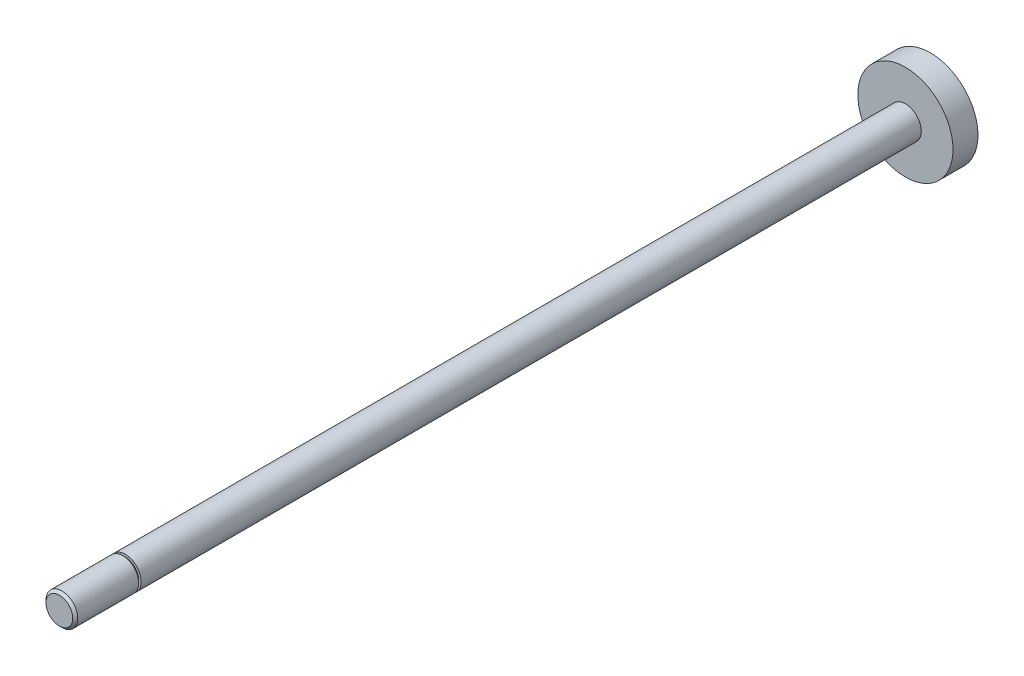
ISO-10303-21;
HEADER;
FILE_DESCRIPTION(('STEP AP214'),'2;1');
FILE_NAME('part.step','',(''),(''),'','','');
FILE_SCHEMA(('AUTOMOTIVE_DESIGN { 1 0 10303 214 1 1 1 1 }'));
ENDSEC;
DATA;
#1=APPLICATION_CONTEXT('core data for automotive mechanical design processes');
#2=APPLICATION_PROTOCOL_DEFINITION('international standard','automotive_design',2000,#1);
#3=PRODUCT_CONTEXT('',#1,'mechanical');
#4=PRODUCT('Part','Part','',(#3));
#5=PRODUCT_RELATED_PRODUCT_CATEGORY('part','',(#4));
#6=PRODUCT_DEFINITION_FORMATION('','',#4);
#7=PRODUCT_DEFINITION_CONTEXT('part definition',#1,'design');
#8=PRODUCT_DEFINITION('design','',#6,#7);
#9=PRODUCT_DEFINITION_SHAPE('','',#8);
#10=(LENGTH_UNIT() NAMED_UNIT(*) SI_UNIT(.MILLI.,.METRE.));
#11=(NAMED_UNIT(*) PLANE_ANGLE_UNIT() SI_UNIT($,.RADIAN.));
#12=(NAMED_UNIT(*) SI_UNIT($,.STERADIAN.) SOLID_ANGLE_UNIT());
#13=UNCERTAINTY_MEASURE_WITH_UNIT(LENGTH_MEASURE(1.E-05),#10,'distance_accuracy_value','');
#14=(GEOMETRIC_REPRESENTATION_CONTEXT(3) GLOBAL_UNCERTAINTY_ASSIGNED_CONTEXT((#13)) GLOBAL_UNIT_ASSIGNED_CONTEXT((#10,
#11,#12)) REPRESENTATION_CONTEXT('',''));
#15=CARTESIAN_POINT('',(0.,0.,0.));
#16=DIRECTION('',(0.,0.,1.));
#17=DIRECTION('',(1.,0.,0.));
#18=AXIS2_PLACEMENT_3D('',#15,#16,#17);
#19=CARTESIAN_POINT('',(0.,0.,2.5));
#20=DIRECTION('',(0.,0.,1.));
#21=DIRECTION('',(1.,0.,0.));
#22=AXIS2_PLACEMENT_3D('',#19,#20,#21);
#23=PLANE('',#22);
#24=CARTESIAN_POINT('',(0.,0.,2.5));
#25=DIRECTION('',(0.,0.,1.));
#26=DIRECTION('',(1.,0.,0.));
#27=AXIS2_PLACEMENT_3D('',#24,#25,#26);
#28=CIRCLE('',#27,9.525);
#29=CARTESIAN_POINT('',(9.525,0.,2.5));
#30=VERTEX_POINT('',#29);
#31=EDGE_CURVE('E45',#30,#30,#28,.T.);
#32=ORIENTED_EDGE('',*,*,#31,.T.);
#33=EDGE_LOOP('',(#32));
#34=FACE_BOUND('',#33,.T.);
#35=CARTESIAN_POINT('',(0.,0.,2.5));
#36=DIRECTION('',(0.,0.,1.));
#37=DIRECTION('',(1.,0.,0.));
#38=AXIS2_PLACEMENT_3D('',#35,#36,#37);
#39=CIRCLE('',#38,3.175);
#40=CARTESIAN_POINT('',(3.175,0.,2.5));
#41=VERTEX_POINT('',#40);
#42=EDGE_CURVE('E10',#41,#41,#39,.T.);
#43=ORIENTED_EDGE('',*,*,#42,.F.);
#44=EDGE_LOOP('',(#43));
#45=FACE_BOUND('',#44,.T.);
#46=ADVANCED_FACE('F37',(#34,#45),#23,.T.);
#47=CARTESIAN_POINT('',(0.,0.,2.5));
#48=DIRECTION('',(0.,0.,-1.));
#49=DIRECTION('',(-1.,0.,0.));
#50=AXIS2_PLACEMENT_3D('',#47,#48,#49);
#51=CYLINDRICAL_SURFACE('',#50,9.525);
#52=ORIENTED_EDGE('',*,*,#31,.F.);
#53=EDGE_LOOP('',(#52));
#54=FACE_BOUND('',#53,.T.);
#55=CARTESIAN_POINT('',(0.,0.,-2.5));
#56=DIRECTION('',(0.,0.,1.));
#57=DIRECTION('',(1.,0.,0.));
#58=AXIS2_PLACEMENT_3D('',#55,#56,#57);
#59=CIRCLE('',#58,9.525);
#60=CARTESIAN_POINT('',(9.525,0.,-2.5));
#61=VERTEX_POINT('',#60);
#62=EDGE_CURVE('E49',#61,#61,#59,.T.);
#63=ORIENTED_EDGE('',*,*,#62,.T.);
#64=EDGE_LOOP('',(#63));
#65=FACE_BOUND('',#64,.T.);
#66=ADVANCED_FACE('F105',(#54,#65),#51,.T.);
#67=CARTESIAN_POINT('',(0.,0.,-2.5));
#68=DIRECTION('',(0.,0.,1.));
#69=DIRECTION('',(1.,0.,0.));
#70=AXIS2_PLACEMENT_3D('',#67,#68,#69);
#71=PLANE('',#70);
#72=ORIENTED_EDGE('',*,*,#62,.F.);
#73=EDGE_LOOP('',(#72));
#74=FACE_BOUND('',#73,.T.);
#75=ADVANCED_FACE('F102',(#74),#71,.F.);
#76=CARTESIAN_POINT('',(0.,0.,180.811256121069));
#77=DIRECTION('',(0.,0.,-1.));
#78=DIRECTION('',(-1.,0.,0.));
#79=AXIS2_PLACEMENT_3D('',#76,#77,#78);
#80=CYLINDRICAL_SURFACE('',#79,3.175);
#81=CARTESIAN_POINT('',(0.,0.,158.631));
#82=DIRECTION('',(0.,0.,-1.));
#83=DIRECTION('',(-1.,0.,0.));
#84=AXIS2_PLACEMENT_3D('',#81,#82,#83);
#85=CIRCLE('',#84,3.175);
#86=CARTESIAN_POINT('',(-3.175,0.,158.631));
#87=VERTEX_POINT('',#86);
#88=EDGE_CURVE('E41',#87,#87,#85,.T.);
#89=ORIENTED_EDGE('',*,*,#88,.T.);
#90=EDGE_LOOP('',(#89));
#91=FACE_BOUND('',#90,.T.);
#92=ORIENTED_EDGE('',*,*,#42,.T.);
#93=EDGE_LOOP('',(#92));
#94=FACE_BOUND('',#93,.T.);
#95=ADVANCED_FACE('F39',(#91,#94),#80,.T.);
#96=CARTESIAN_POINT('',(0.,2.67499999999997,158.631));
#97=DIRECTION('',(0.,0.,-1.));
#98=DIRECTION('',(-1.,0.,0.));
#99=AXIS2_PLACEMENT_3D('',#96,#97,#98);
#100=PLANE('',#99);
#101=CARTESIAN_POINT('',(0.,0.,158.631));
#102=DIRECTION('',(0.,0.,-1.));
#103=DIRECTION('',(-1.,0.,0.));
#104=AXIS2_PLACEMENT_3D('',#101,#102,#103);
#105=CIRCLE('',#104,2.67499999999997);
#106=CARTESIAN_POINT('',(-2.67499999999997,0.,158.631));
#107=VERTEX_POINT('',#106);
#108=EDGE_CURVE('E70',#107,#107,#105,.T.);
#109=ORIENTED_EDGE('',*,*,#108,.T.);
#110=EDGE_LOOP('',(#109));
#111=FACE_BOUND('',#110,.T.);
#112=ORIENTED_EDGE('',*,*,#88,.F.);
#113=EDGE_LOOP('',(#112));
#114=FACE_BOUND('',#113,.T.);
#115=ADVANCED_FACE('F76',(#111,#114),#100,.F.);
#116=CARTESIAN_POINT('',(0.,3.17499999999997,159.131));
#117=DIRECTION('',(0.,0.,1.));
#118=DIRECTION('',(1.,0.,0.));
#119=AXIS2_PLACEMENT_3D('',#116,#117,#118);
#120=PLANE('',#119);
#121=CARTESIAN_POINT('',(0.,0.,159.131));
#122=DIRECTION('',(0.,0.,-1.));
#123=DIRECTION('',(-1.,0.,0.));
#124=AXIS2_PLACEMENT_3D('',#121,#122,#123);
#125=CIRCLE('',#124,2.67499999999997);
#126=CARTESIAN_POINT('',(-2.67499999999997,0.,159.131));
#127=VERTEX_POINT('',#126);
#128=EDGE_CURVE('E66',#127,#127,#125,.T.);
#129=ORIENTED_EDGE('',*,*,#128,.F.);
#130=EDGE_LOOP('',(#129));
#131=FACE_BOUND('',#130,.T.);
#132=CARTESIAN_POINT('',(0.,0.,159.131));
#133=DIRECTION('',(0.,0.,-1.));
#134=DIRECTION('',(-1.,0.,0.));
#135=AXIS2_PLACEMENT_3D('',#132,#133,#134);
#136=CIRCLE('',#135,3.17499999999997);
#137=CARTESIAN_POINT('',(-3.17499999999997,0.,159.131));
#138=VERTEX_POINT('',#137);
#139=EDGE_CURVE('E62',#138,#138,#136,.T.);
#140=ORIENTED_EDGE('',*,*,#139,.T.);
#141=EDGE_LOOP('',(#140));
#142=FACE_BOUND('',#141,.T.);
#143=ADVANCED_FACE('F83',(#131,#142),#120,.F.);
#144=CARTESIAN_POINT('',(0.,0.,0.));
#145=DIRECTION('',(0.,0.,-1.));
#146=DIRECTION('',(-1.,0.,0.));
#147=AXIS2_PLACEMENT_3D('',#144,#145,#146);
#148=CYLINDRICAL_SURFACE('',#147,2.67499999999997);
#149=ORIENTED_EDGE('',*,*,#108,.F.);
#150=EDGE_LOOP('',(#149));
#151=FACE_BOUND('',#150,.T.);
#152=ORIENTED_EDGE('',*,*,#128,.T.);
#153=EDGE_LOOP('',(#152));
#154=FACE_BOUND('',#153,.T.);
#155=ADVANCED_FACE('F79',(#151,#154),#148,.T.);
#156=CARTESIAN_POINT('',(0.,0.,171.331));
#157=DIRECTION('',(0.,0.,-1.));
#158=DIRECTION('',(-1.,0.,0.));
#159=AXIS2_PLACEMENT_3D('',#156,#157,#158);
#160=CIRCLE('',#159,3.17499999999997);
#161=CARTESIAN_POINT('',(-3.17499999999997,0.,171.331));
#162=VERTEX_POINT('',#161);
#163=EDGE_CURVE('E58',#162,#162,#160,.T.);
#164=ORIENTED_EDGE('',*,*,#163,.T.);
#165=EDGE_LOOP('',(#164));
#166=FACE_BOUND('',#165,.T.);
#167=ORIENTED_EDGE('',*,*,#139,.F.);
#168=EDGE_LOOP('',(#167));
#169=FACE_BOUND('',#168,.T.);
#170=ADVANCED_FACE('F82',(#166,#169),#80,.T.);
#171=CARTESIAN_POINT('',(0.,0.,171.831));
#172=DIRECTION('',(0.,0.,-1.));
#173=DIRECTION('',(-1.,0.,0.));
#174=AXIS2_PLACEMENT_3D('',#171,#172,#173);
#175=CONICAL_SURFACE('',#174,2.67499999999998,0.785398163397419);
#176=ORIENTED_EDGE('',*,*,#163,.F.);
#177=EDGE_LOOP('',(#176));
#178=FACE_BOUND('',#177,.T.);
#179=CARTESIAN_POINT('',(0.,0.,171.831));
#180=DIRECTION('',(0.,0.,-1.));
#181=DIRECTION('',(-1.,0.,0.));
#182=AXIS2_PLACEMENT_3D('',#179,#180,#181);
#183=CIRCLE('',#182,2.67499999999998);
#184=CARTESIAN_POINT('',(-2.67499999999998,0.,171.831));
#185=VERTEX_POINT('',#184);
#186=EDGE_CURVE('E54',#185,#185,#183,.T.);
#187=ORIENTED_EDGE('',*,*,#186,.T.);
#188=EDGE_LOOP('',(#187));
#189=FACE_BOUND('',#188,.T.);
#190=ADVANCED_FACE('F93',(#178,#189),#175,.T.);
#191=CARTESIAN_POINT('',(0.,0.,171.831));
#192=DIRECTION('',(0.,0.,-1.));
#193=DIRECTION('',(-1.,0.,0.));
#194=AXIS2_PLACEMENT_3D('',#191,#192,#193);
#195=PLANE('',#194);
#196=ORIENTED_EDGE('',*,*,#186,.F.);
#197=EDGE_LOOP('',(#196));
#198=FACE_BOUND('',#197,.T.);
#199=ADVANCED_FACE('F98',(#198),#195,.F.);
#200=CLOSED_SHELL('',(#46,#66,#75,#95,#115,#143,#155,#170,#190,#199));
#201=MANIFOLD_SOLID_BREP('B2',#200);
#202=ADVANCED_BREP_SHAPE_REPRESENTATION('',(#18,#201),#14);
#203=SHAPE_DEFINITION_REPRESENTATION(#9,#202);
ENDSEC;
END-ISO-10303-21;
